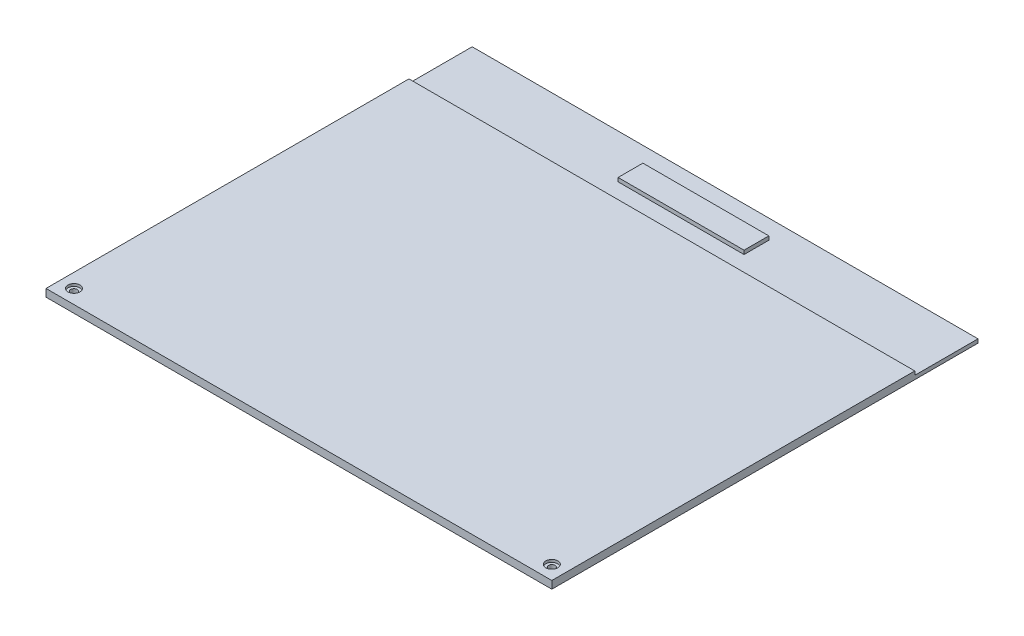
ISO-10303-21;
HEADER;
FILE_DESCRIPTION(('STEP AP214'),'2;1');
FILE_NAME('part.step','',(''),(''),'','','');
FILE_SCHEMA(('AUTOMOTIVE_DESIGN { 1 0 10303 214 1 1 1 1 }'));
ENDSEC;
DATA;
#1=APPLICATION_CONTEXT('core data for automotive mechanical design processes');
#2=APPLICATION_PROTOCOL_DEFINITION('international standard','automotive_design',2000,#1);
#3=PRODUCT_CONTEXT('',#1,'mechanical');
#4=PRODUCT('Part','Part','',(#3));
#5=PRODUCT_RELATED_PRODUCT_CATEGORY('part','',(#4));
#6=PRODUCT_DEFINITION_FORMATION('','',#4);
#7=PRODUCT_DEFINITION_CONTEXT('part definition',#1,'design');
#8=PRODUCT_DEFINITION('design','',#6,#7);
#9=PRODUCT_DEFINITION_SHAPE('','',#8);
#10=(LENGTH_UNIT() NAMED_UNIT(*) SI_UNIT(.MILLI.,.METRE.));
#11=(NAMED_UNIT(*) PLANE_ANGLE_UNIT() SI_UNIT($,.RADIAN.));
#12=(NAMED_UNIT(*) SI_UNIT($,.STERADIAN.) SOLID_ANGLE_UNIT());
#13=UNCERTAINTY_MEASURE_WITH_UNIT(LENGTH_MEASURE(1.E-05),#10,'distance_accuracy_value','');
#14=(GEOMETRIC_REPRESENTATION_CONTEXT(3) GLOBAL_UNCERTAINTY_ASSIGNED_CONTEXT((#13)) GLOBAL_UNIT_ASSIGNED_CONTEXT((#10,
#11,#12)) REPRESENTATION_CONTEXT('',''));
#15=CARTESIAN_POINT('',(0.,0.,0.));
#16=DIRECTION('',(0.,0.,1.));
#17=DIRECTION('',(1.,0.,0.));
#18=AXIS2_PLACEMENT_3D('',#15,#16,#17);
#19=CARTESIAN_POINT('',(100.,1.5,-33.5));
#20=DIRECTION('',(0.,-1.,0.));
#21=DIRECTION('',(0.,0.,-1.));
#22=AXIS2_PLACEMENT_3D('',#19,#20,#21);
#23=PLANE('',#22);
#24=DIRECTION('',(1.,0.,0.));
#25=VECTOR('',#24,1.);
#26=CARTESIAN_POINT('',(100.,1.5,-8.5));
#27=LINE('',#26,#25);
#28=CARTESIAN_POINT('',(-100.,1.5,-8.50000000000001));
#29=VERTEX_POINT('',#28);
#30=CARTESIAN_POINT('',(100.,1.5,-8.5));
#31=VERTEX_POINT('',#30);
#32=EDGE_CURVE('E132',#29,#31,#27,.T.);
#33=ORIENTED_EDGE('',*,*,#32,.T.);
#34=DIRECTION('',(0.,0.,1.));
#35=VECTOR('',#34,1.);
#36=CARTESIAN_POINT('',(100.,1.5,-33.5));
#37=LINE('',#36,#35);
#38=CARTESIAN_POINT('',(100.,1.5,-33.5));
#39=VERTEX_POINT('',#38);
#40=EDGE_CURVE('E149',#39,#31,#37,.T.);
#41=ORIENTED_EDGE('',*,*,#40,.F.);
#42=DIRECTION('',(1.,0.,0.));
#43=VECTOR('',#42,1.);
#44=CARTESIAN_POINT('',(100.,1.5,-33.5));
#45=LINE('',#44,#43);
#46=CARTESIAN_POINT('',(-100.,1.5,-33.5));
#47=VERTEX_POINT('',#46);
#48=EDGE_CURVE('E148',#47,#39,#45,.T.);
#49=ORIENTED_EDGE('',*,*,#48,.F.);
#50=DIRECTION('',(0.,0.,1.));
#51=VECTOR('',#50,1.);
#52=CARTESIAN_POINT('',(-100.,1.5,-33.5));
#53=LINE('',#52,#51);
#54=EDGE_CURVE('E153',#47,#29,#53,.T.);
#55=ORIENTED_EDGE('',*,*,#54,.T.);
#56=EDGE_LOOP('',(#33,#41,#49,#55));
#57=FACE_BOUND('',#56,.T.);
#58=DIRECTION('',(0.,0.,1.));
#59=VECTOR('',#58,1.);
#60=CARTESIAN_POINT('',(-24.9,1.5,-25.9));
#61=LINE('',#60,#59);
#62=CARTESIAN_POINT('',(-24.9,1.5,-25.9));
#63=VERTEX_POINT('',#62);
#64=CARTESIAN_POINT('',(-24.9,1.5,-16.1));
#65=VERTEX_POINT('',#64);
#66=EDGE_CURVE('E131',#63,#65,#61,.T.);
#67=ORIENTED_EDGE('',*,*,#66,.F.);
#68=DIRECTION('',(-1.,0.,0.));
#69=VECTOR('',#68,1.);
#70=CARTESIAN_POINT('',(24.9,1.5,-25.9));
#71=LINE('',#70,#69);
#72=CARTESIAN_POINT('',(24.9,1.5,-25.9));
#73=VERTEX_POINT('',#72);
#74=EDGE_CURVE('E128',#73,#63,#71,.T.);
#75=ORIENTED_EDGE('',*,*,#74,.F.);
#76=DIRECTION('',(0.,0.,-1.));
#77=VECTOR('',#76,1.);
#78=CARTESIAN_POINT('',(24.9,1.5,-25.9));
#79=LINE('',#78,#77);
#80=CARTESIAN_POINT('',(24.9,1.5,-16.1));
#81=VERTEX_POINT('',#80);
#82=EDGE_CURVE('E54',#81,#73,#79,.T.);
#83=ORIENTED_EDGE('',*,*,#82,.F.);
#84=DIRECTION('',(1.,0.,0.));
#85=VECTOR('',#84,1.);
#86=CARTESIAN_POINT('',(24.9,1.5,-16.1));
#87=LINE('',#86,#85);
#88=EDGE_CURVE('E49',#65,#81,#87,.T.);
#89=ORIENTED_EDGE('',*,*,#88,.F.);
#90=EDGE_LOOP('',(#67,#75,#83,#89));
#91=FACE_BOUND('',#90,.T.);
#92=ADVANCED_FACE('F33',(#57,#91),#23,.F.);
#93=CARTESIAN_POINT('',(0.,0.,-8.5));
#94=DIRECTION('',(0.,0.,1.));
#95=DIRECTION('',(1.,0.,0.));
#96=AXIS2_PLACEMENT_3D('',#93,#94,#95);
#97=PLANE('',#96);
#98=ORIENTED_EDGE('',*,*,#32,.F.);
#99=DIRECTION('',(0.,-1.,0.));
#100=VECTOR('',#99,1.);
#101=CARTESIAN_POINT('',(-100.,3.,-8.50000000000001));
#102=LINE('',#101,#100);
#103=CARTESIAN_POINT('',(-100.,3.,-8.50000000000001));
#104=VERTEX_POINT('',#103);
#105=EDGE_CURVE('E11',#104,#29,#102,.T.);
#106=ORIENTED_EDGE('',*,*,#105,.F.);
#107=DIRECTION('',(-1.,0.,0.));
#108=VECTOR('',#107,1.);
#109=CARTESIAN_POINT('',(0.,3.,-8.5));
#110=LINE('',#109,#108);
#111=CARTESIAN_POINT('',(100.,3.,-8.50000000000001));
#112=VERTEX_POINT('',#111);
#113=EDGE_CURVE('E37',#112,#104,#110,.T.);
#114=ORIENTED_EDGE('',*,*,#113,.F.);
#115=DIRECTION('',(0.,1.,0.));
#116=VECTOR('',#115,1.);
#117=CARTESIAN_POINT('',(100.,3.,-8.50000000000001));
#118=LINE('',#117,#116);
#119=EDGE_CURVE('E42',#31,#112,#118,.T.);
#120=ORIENTED_EDGE('',*,*,#119,.F.);
#121=EDGE_LOOP('',(#98,#106,#114,#120));
#122=FACE_BOUND('',#121,.T.);
#123=ADVANCED_FACE('F35',(#122),#97,.F.);
#124=CARTESIAN_POINT('',(94.474873734153,0.,129.474873734153));
#125=DIRECTION('',(0.,1.,0.));
#126=DIRECTION('',(0.,0.,1.));
#127=AXIS2_PLACEMENT_3D('',#124,#125,#126);
#128=CYLINDRICAL_SURFACE('',#127,1.29999999999999);
#129=CARTESIAN_POINT('',(94.474873734153,0.,129.474873734153));
#130=DIRECTION('',(0.,1.,0.));
#131=DIRECTION('',(0.,0.,1.));
#132=AXIS2_PLACEMENT_3D('',#129,#130,#131);
#133=CIRCLE('',#132,1.29999999999999);
#134=CARTESIAN_POINT('',(94.474873734153,0.,130.774873734153));
#135=VERTEX_POINT('',#134);
#136=EDGE_CURVE('E169',#135,#135,#133,.T.);
#137=ORIENTED_EDGE('',*,*,#136,.F.);
#138=EDGE_LOOP('',(#137));
#139=FACE_BOUND('',#138,.T.);
#140=CARTESIAN_POINT('',(94.474873734153,2.,129.474873734153));
#141=DIRECTION('',(0.,1.,0.));
#142=DIRECTION('',(0.,0.,1.));
#143=AXIS2_PLACEMENT_3D('',#140,#141,#142);
#144=CIRCLE('',#143,1.29999999999999);
#145=CARTESIAN_POINT('',(94.474873734153,2.,130.774873734153));
#146=VERTEX_POINT('',#145);
#147=EDGE_CURVE('E176',#146,#146,#144,.F.);
#148=ORIENTED_EDGE('',*,*,#147,.F.);
#149=EDGE_LOOP('',(#148));
#150=FACE_BOUND('',#149,.T.);
#151=ADVANCED_FACE('F238',(#139,#150),#128,.F.);
#152=CARTESIAN_POINT('',(-94.4748737341529,0.,129.474873734153));
#153=DIRECTION('',(0.,1.,0.));
#154=DIRECTION('',(0.,0.,1.));
#155=AXIS2_PLACEMENT_3D('',#152,#153,#154);
#156=CYLINDRICAL_SURFACE('',#155,1.29999999999999);
#157=CARTESIAN_POINT('',(-94.4748737341529,0.,129.474873734153));
#158=DIRECTION('',(0.,1.,0.));
#159=DIRECTION('',(0.,0.,-1.));
#160=AXIS2_PLACEMENT_3D('',#157,#158,#159);
#161=CIRCLE('',#160,1.29999999999999);
#162=CARTESIAN_POINT('',(-94.4748737341529,0.,128.174873734153));
#163=VERTEX_POINT('',#162);
#164=EDGE_CURVE('E173',#163,#163,#161,.T.);
#165=ORIENTED_EDGE('',*,*,#164,.F.);
#166=EDGE_LOOP('',(#165));
#167=FACE_BOUND('',#166,.T.);
#168=CARTESIAN_POINT('',(-94.4748737341529,2.,129.474873734153));
#169=DIRECTION('',(0.,1.,0.));
#170=DIRECTION('',(0.,0.,1.));
#171=AXIS2_PLACEMENT_3D('',#168,#169,#170);
#172=CIRCLE('',#171,1.29999999999999);
#173=CARTESIAN_POINT('',(-94.4748737341529,2.,130.774873734153));
#174=VERTEX_POINT('',#173);
#175=EDGE_CURVE('E166',#174,#174,#172,.F.);
#176=ORIENTED_EDGE('',*,*,#175,.F.);
#177=EDGE_LOOP('',(#176));
#178=FACE_BOUND('',#177,.T.);
#179=ADVANCED_FACE('F261',(#167,#178),#156,.F.);
#180=CARTESIAN_POINT('',(-100.,3.,-135.));
#181=DIRECTION('',(1.,0.,0.));
#182=DIRECTION('',(0.,0.,-1.));
#183=AXIS2_PLACEMENT_3D('',#180,#181,#182);
#184=PLANE('',#183);
#185=DIRECTION('',(0.,0.,1.));
#186=VECTOR('',#185,1.);
#187=CARTESIAN_POINT('',(-100.,3.,-135.));
#188=LINE('',#187,#186);
#189=CARTESIAN_POINT('',(-100.,3.,135.));
#190=VERTEX_POINT('',#189);
#191=EDGE_CURVE('E177',#104,#190,#188,.T.);
#192=ORIENTED_EDGE('',*,*,#191,.F.);
#193=ORIENTED_EDGE('',*,*,#105,.T.);
#194=ORIENTED_EDGE('',*,*,#54,.F.);
#195=DIRECTION('',(0.,1.,0.));
#196=VECTOR('',#195,1.);
#197=CARTESIAN_POINT('',(-100.,0.,-33.5));
#198=LINE('',#197,#196);
#199=CARTESIAN_POINT('',(-100.,0.,-33.5));
#200=VERTEX_POINT('',#199);
#201=EDGE_CURVE('E146',#200,#47,#198,.T.);
#202=ORIENTED_EDGE('',*,*,#201,.F.);
#203=DIRECTION('',(0.,0.,1.));
#204=VECTOR('',#203,1.);
#205=CARTESIAN_POINT('',(-100.,0.,-135.));
#206=LINE('',#205,#204);
#207=CARTESIAN_POINT('',(-100.,0.,135.));
#208=VERTEX_POINT('',#207);
#209=EDGE_CURVE('E172',#200,#208,#206,.T.);
#210=ORIENTED_EDGE('',*,*,#209,.T.);
#211=DIRECTION('',(0.,-1.,0.));
#212=VECTOR('',#211,1.);
#213=CARTESIAN_POINT('',(-100.,3.,135.));
#214=LINE('',#213,#212);
#215=EDGE_CURVE('E192',#190,#208,#214,.T.);
#216=ORIENTED_EDGE('',*,*,#215,.F.);
#217=EDGE_LOOP('',(#192,#193,#194,#202,#210,#216));
#218=FACE_BOUND('',#217,.T.);
#219=ADVANCED_FACE('F211',(#218),#184,.F.);
#220=CARTESIAN_POINT('',(100.,3.,135.));
#221=DIRECTION('',(0.,0.,-1.));
#222=DIRECTION('',(-1.,0.,0.));
#223=AXIS2_PLACEMENT_3D('',#220,#221,#222);
#224=PLANE('',#223);
#225=DIRECTION('',(1.,0.,0.));
#226=VECTOR('',#225,1.);
#227=CARTESIAN_POINT('',(100.,0.,135.));
#228=LINE('',#227,#226);
#229=CARTESIAN_POINT('',(100.,0.,135.));
#230=VERTEX_POINT('',#229);
#231=EDGE_CURVE('E187',#208,#230,#228,.T.);
#232=ORIENTED_EDGE('',*,*,#231,.T.);
#233=DIRECTION('',(0.,-1.,0.));
#234=VECTOR('',#233,1.);
#235=CARTESIAN_POINT('',(100.,3.,135.));
#236=LINE('',#235,#234);
#237=CARTESIAN_POINT('',(100.,3.,135.));
#238=VERTEX_POINT('',#237);
#239=EDGE_CURVE('E185',#238,#230,#236,.T.);
#240=ORIENTED_EDGE('',*,*,#239,.F.);
#241=DIRECTION('',(1.,0.,0.));
#242=VECTOR('',#241,1.);
#243=CARTESIAN_POINT('',(100.,3.,135.));
#244=LINE('',#243,#242);
#245=EDGE_CURVE('E179',#190,#238,#244,.T.);
#246=ORIENTED_EDGE('',*,*,#245,.F.);
#247=ORIENTED_EDGE('',*,*,#215,.T.);
#248=EDGE_LOOP('',(#232,#240,#246,#247));
#249=FACE_BOUND('',#248,.T.);
#250=ADVANCED_FACE('F215',(#249),#224,.F.);
#251=CARTESIAN_POINT('',(100.,3.,-135.));
#252=DIRECTION('',(-1.,0.,0.));
#253=DIRECTION('',(0.,0.,1.));
#254=AXIS2_PLACEMENT_3D('',#251,#252,#253);
#255=PLANE('',#254);
#256=DIRECTION('',(0.,0.,-1.));
#257=VECTOR('',#256,1.);
#258=CARTESIAN_POINT('',(100.,0.,-135.));
#259=LINE('',#258,#257);
#260=CARTESIAN_POINT('',(100.,0.,-33.5));
#261=VERTEX_POINT('',#260);
#262=EDGE_CURVE('E180',#230,#261,#259,.T.);
#263=ORIENTED_EDGE('',*,*,#262,.T.);
#264=DIRECTION('',(0.,-1.,0.));
#265=VECTOR('',#264,1.);
#266=CARTESIAN_POINT('',(100.,0.,-33.5));
#267=LINE('',#266,#265);
#268=EDGE_CURVE('E135',#39,#261,#267,.T.);
#269=ORIENTED_EDGE('',*,*,#268,.F.);
#270=ORIENTED_EDGE('',*,*,#40,.T.);
#271=ORIENTED_EDGE('',*,*,#119,.T.);
#272=DIRECTION('',(0.,0.,-1.));
#273=VECTOR('',#272,1.);
#274=CARTESIAN_POINT('',(100.,3.,-135.));
#275=LINE('',#274,#273);
#276=EDGE_CURVE('E182',#238,#112,#275,.T.);
#277=ORIENTED_EDGE('',*,*,#276,.F.);
#278=ORIENTED_EDGE('',*,*,#239,.T.);
#279=EDGE_LOOP('',(#263,#269,#270,#271,#277,#278));
#280=FACE_BOUND('',#279,.T.);
#281=ADVANCED_FACE('F218',(#280),#255,.F.);
#282=CARTESIAN_POINT('',(0.,3.,0.));
#283=DIRECTION('',(0.,-1.,0.));
#284=DIRECTION('',(0.,0.,-1.));
#285=AXIS2_PLACEMENT_3D('',#282,#283,#284);
#286=PLANE('',#285);
#287=CARTESIAN_POINT('',(-94.4748737341529,3.,129.474873734153));
#288=DIRECTION('',(0.,1.,0.));
#289=DIRECTION('',(0.,0.,1.));
#290=AXIS2_PLACEMENT_3D('',#287,#288,#289);
#291=CIRCLE('',#290,2.375);
#292=CARTESIAN_POINT('',(-94.4748737341529,3.,131.849873734153));
#293=VERTEX_POINT('',#292);
#294=EDGE_CURVE('E160',#293,#293,#291,.T.);
#295=ORIENTED_EDGE('',*,*,#294,.F.);
#296=EDGE_LOOP('',(#295));
#297=FACE_BOUND('',#296,.T.);
#298=CARTESIAN_POINT('',(94.474873734153,3.,129.474873734153));
#299=DIRECTION('',(0.,1.,0.));
#300=DIRECTION('',(0.,0.,1.));
#301=AXIS2_PLACEMENT_3D('',#298,#299,#300);
#302=CIRCLE('',#301,2.375);
#303=CARTESIAN_POINT('',(94.474873734153,3.,131.849873734153));
#304=VERTEX_POINT('',#303);
#305=EDGE_CURVE('E156',#304,#304,#302,.T.);
#306=ORIENTED_EDGE('',*,*,#305,.F.);
#307=EDGE_LOOP('',(#306));
#308=FACE_BOUND('',#307,.T.);
#309=ORIENTED_EDGE('',*,*,#276,.T.);
#310=ORIENTED_EDGE('',*,*,#113,.T.);
#311=ORIENTED_EDGE('',*,*,#191,.T.);
#312=ORIENTED_EDGE('',*,*,#245,.T.);
#313=EDGE_LOOP('',(#309,#310,#311,#312));
#314=FACE_BOUND('',#313,.T.);
#315=ADVANCED_FACE('F204',(#297,#308,#314),#286,.F.);
#316=CARTESIAN_POINT('',(0.,0.,0.));
#317=DIRECTION('',(0.,-1.,0.));
#318=DIRECTION('',(0.,0.,-1.));
#319=AXIS2_PLACEMENT_3D('',#316,#317,#318);
#320=PLANE('',#319);
#321=ORIENTED_EDGE('',*,*,#209,.F.);
#322=DIRECTION('',(-1.,0.,0.));
#323=VECTOR('',#322,1.);
#324=CARTESIAN_POINT('',(100.,0.,-33.5));
#325=LINE('',#324,#323);
#326=EDGE_CURVE('E143',#261,#200,#325,.T.);
#327=ORIENTED_EDGE('',*,*,#326,.F.);
#328=ORIENTED_EDGE('',*,*,#262,.F.);
#329=ORIENTED_EDGE('',*,*,#231,.F.);
#330=EDGE_LOOP('',(#321,#327,#328,#329));
#331=FACE_BOUND('',#330,.T.);
#332=ORIENTED_EDGE('',*,*,#164,.T.);
#333=EDGE_LOOP('',(#332));
#334=FACE_BOUND('',#333,.T.);
#335=ORIENTED_EDGE('',*,*,#136,.T.);
#336=EDGE_LOOP('',(#335));
#337=FACE_BOUND('',#336,.T.);
#338=ADVANCED_FACE('F227',(#331,#334,#337),#320,.T.);
#339=CARTESIAN_POINT('',(-94.4748737341529,2.,129.474873734153));
#340=DIRECTION('',(0.,1.,0.));
#341=DIRECTION('',(0.,0.,1.));
#342=AXIS2_PLACEMENT_3D('',#339,#340,#341);
#343=PLANE('',#342);
#344=CARTESIAN_POINT('',(-94.4748737341529,2.,129.474873734153));
#345=DIRECTION('',(0.,1.,0.));
#346=DIRECTION('',(0.,0.,1.));
#347=AXIS2_PLACEMENT_3D('',#344,#345,#346);
#348=CIRCLE('',#347,2.375);
#349=CARTESIAN_POINT('',(-94.4748737341529,2.,131.849873734153));
#350=VERTEX_POINT('',#349);
#351=EDGE_CURVE('E163',#350,#350,#348,.T.);
#352=ORIENTED_EDGE('',*,*,#351,.T.);
#353=EDGE_LOOP('',(#352));
#354=FACE_BOUND('',#353,.T.);
#355=ORIENTED_EDGE('',*,*,#175,.T.);
#356=EDGE_LOOP('',(#355));
#357=FACE_BOUND('',#356,.T.);
#358=ADVANCED_FACE('F252',(#354,#357),#343,.T.);
#359=CARTESIAN_POINT('',(-94.4748737341529,2.,129.474873734153));
#360=DIRECTION('',(0.,1.,0.));
#361=DIRECTION('',(0.,0.,1.));
#362=AXIS2_PLACEMENT_3D('',#359,#360,#361);
#363=CYLINDRICAL_SURFACE('',#362,2.375);
#364=ORIENTED_EDGE('',*,*,#351,.F.);
#365=EDGE_LOOP('',(#364));
#366=FACE_BOUND('',#365,.T.);
#367=ORIENTED_EDGE('',*,*,#294,.T.);
#368=EDGE_LOOP('',(#367));
#369=FACE_BOUND('',#368,.T.);
#370=ADVANCED_FACE('F247',(#366,#369),#363,.F.);
#371=CARTESIAN_POINT('',(94.474873734153,2.,129.474873734153));
#372=DIRECTION('',(0.,1.,0.));
#373=DIRECTION('',(0.,0.,1.));
#374=AXIS2_PLACEMENT_3D('',#371,#372,#373);
#375=PLANE('',#374);
#376=CARTESIAN_POINT('',(94.474873734153,2.,129.474873734153));
#377=DIRECTION('',(0.,1.,0.));
#378=DIRECTION('',(0.,0.,1.));
#379=AXIS2_PLACEMENT_3D('',#376,#377,#378);
#380=CIRCLE('',#379,2.375);
#381=CARTESIAN_POINT('',(94.474873734153,2.,131.849873734153));
#382=VERTEX_POINT('',#381);
#383=EDGE_CURVE('E157',#382,#382,#380,.T.);
#384=ORIENTED_EDGE('',*,*,#383,.T.);
#385=EDGE_LOOP('',(#384));
#386=FACE_BOUND('',#385,.T.);
#387=ORIENTED_EDGE('',*,*,#147,.T.);
#388=EDGE_LOOP('',(#387));
#389=FACE_BOUND('',#388,.T.);
#390=ADVANCED_FACE('F244',(#386,#389),#375,.T.);
#391=CARTESIAN_POINT('',(94.474873734153,2.,129.474873734153));
#392=DIRECTION('',(0.,1.,0.));
#393=DIRECTION('',(0.,0.,1.));
#394=AXIS2_PLACEMENT_3D('',#391,#392,#393);
#395=CYLINDRICAL_SURFACE('',#394,2.375);
#396=ORIENTED_EDGE('',*,*,#383,.F.);
#397=EDGE_LOOP('',(#396));
#398=FACE_BOUND('',#397,.T.);
#399=ORIENTED_EDGE('',*,*,#305,.T.);
#400=EDGE_LOOP('',(#399));
#401=FACE_BOUND('',#400,.T.);
#402=ADVANCED_FACE('F239',(#398,#401),#395,.F.);
#403=CARTESIAN_POINT('',(0.,0.,-33.5));
#404=DIRECTION('',(0.,0.,1.));
#405=DIRECTION('',(1.,0.,0.));
#406=AXIS2_PLACEMENT_3D('',#403,#404,#405);
#407=PLANE('',#406);
#408=ORIENTED_EDGE('',*,*,#268,.T.);
#409=ORIENTED_EDGE('',*,*,#326,.T.);
#410=ORIENTED_EDGE('',*,*,#201,.T.);
#411=ORIENTED_EDGE('',*,*,#48,.T.);
#412=EDGE_LOOP('',(#408,#409,#410,#411));
#413=FACE_BOUND('',#412,.T.);
#414=ADVANCED_FACE('F242',(#413),#407,.F.);
#415=CARTESIAN_POINT('',(-24.9,3.,-25.9));
#416=DIRECTION('',(1.,0.,0.));
#417=DIRECTION('',(0.,0.,-1.));
#418=AXIS2_PLACEMENT_3D('',#415,#416,#417);
#419=PLANE('',#418);
#420=ORIENTED_EDGE('',*,*,#66,.T.);
#421=DIRECTION('',(0.,-1.,0.));
#422=VECTOR('',#421,1.);
#423=CARTESIAN_POINT('',(-24.9,3.,-16.1));
#424=LINE('',#423,#422);
#425=CARTESIAN_POINT('',(-24.9,3.,-16.1));
#426=VERTEX_POINT('',#425);
#427=EDGE_CURVE('E112',#426,#65,#424,.T.);
#428=ORIENTED_EDGE('',*,*,#427,.F.);
#429=DIRECTION('',(0.,0.,1.));
#430=VECTOR('',#429,1.);
#431=CARTESIAN_POINT('',(-24.9,3.,-25.9));
#432=LINE('',#431,#430);
#433=CARTESIAN_POINT('',(-24.9,3.,-25.9));
#434=VERTEX_POINT('',#433);
#435=EDGE_CURVE('E119',#434,#426,#432,.T.);
#436=ORIENTED_EDGE('',*,*,#435,.F.);
#437=DIRECTION('',(0.,-1.,0.));
#438=VECTOR('',#437,1.);
#439=CARTESIAN_POINT('',(-24.9,3.,-25.9));
#440=LINE('',#439,#438);
#441=EDGE_CURVE('E416',#434,#63,#440,.T.);
#442=ORIENTED_EDGE('',*,*,#441,.T.);
#443=EDGE_LOOP('',(#420,#428,#436,#442));
#444=FACE_BOUND('',#443,.T.);
#445=ADVANCED_FACE('F130',(#444),#419,.F.);
#446=CARTESIAN_POINT('',(24.9,3.,-16.1));
#447=DIRECTION('',(0.,0.,-1.));
#448=DIRECTION('',(-1.,0.,0.));
#449=AXIS2_PLACEMENT_3D('',#446,#447,#448);
#450=PLANE('',#449);
#451=ORIENTED_EDGE('',*,*,#88,.T.);
#452=DIRECTION('',(0.,-1.,0.));
#453=VECTOR('',#452,1.);
#454=CARTESIAN_POINT('',(24.9,3.,-16.1));
#455=LINE('',#454,#453);
#456=CARTESIAN_POINT('',(24.9,3.,-16.1));
#457=VERTEX_POINT('',#456);
#458=EDGE_CURVE('E115',#457,#81,#455,.T.);
#459=ORIENTED_EDGE('',*,*,#458,.F.);
#460=DIRECTION('',(1.,0.,0.));
#461=VECTOR('',#460,1.);
#462=CARTESIAN_POINT('',(24.9,3.,-16.1));
#463=LINE('',#462,#461);
#464=EDGE_CURVE('E108',#426,#457,#463,.T.);
#465=ORIENTED_EDGE('',*,*,#464,.F.);
#466=ORIENTED_EDGE('',*,*,#427,.T.);
#467=EDGE_LOOP('',(#451,#459,#465,#466));
#468=FACE_BOUND('',#467,.T.);
#469=ADVANCED_FACE('F110',(#468),#450,.F.);
#470=CARTESIAN_POINT('',(24.9,3.,-25.9));
#471=DIRECTION('',(-1.,0.,0.));
#472=DIRECTION('',(0.,0.,1.));
#473=AXIS2_PLACEMENT_3D('',#470,#471,#472);
#474=PLANE('',#473);
#475=ORIENTED_EDGE('',*,*,#82,.T.);
#476=DIRECTION('',(0.,-1.,0.));
#477=VECTOR('',#476,1.);
#478=CARTESIAN_POINT('',(24.9,3.,-25.9));
#479=LINE('',#478,#477);
#480=CARTESIAN_POINT('',(24.9,3.,-25.9));
#481=VERTEX_POINT('',#480);
#482=EDGE_CURVE('E137',#481,#73,#479,.T.);
#483=ORIENTED_EDGE('',*,*,#482,.F.);
#484=DIRECTION('',(0.,0.,-1.));
#485=VECTOR('',#484,1.);
#486=CARTESIAN_POINT('',(24.9,3.,-25.9));
#487=LINE('',#486,#485);
#488=EDGE_CURVE('E118',#457,#481,#487,.T.);
#489=ORIENTED_EDGE('',*,*,#488,.F.);
#490=ORIENTED_EDGE('',*,*,#458,.T.);
#491=EDGE_LOOP('',(#475,#483,#489,#490));
#492=FACE_BOUND('',#491,.T.);
#493=ADVANCED_FACE('F289',(#492),#474,.F.);
#494=CARTESIAN_POINT('',(24.9,3.,-25.9));
#495=DIRECTION('',(0.,0.,1.));
#496=DIRECTION('',(1.,0.,0.));
#497=AXIS2_PLACEMENT_3D('',#494,#495,#496);
#498=PLANE('',#497);
#499=ORIENTED_EDGE('',*,*,#74,.T.);
#500=ORIENTED_EDGE('',*,*,#441,.F.);
#501=DIRECTION('',(-1.,0.,0.));
#502=VECTOR('',#501,1.);
#503=CARTESIAN_POINT('',(24.9,3.,-25.9));
#504=LINE('',#503,#502);
#505=EDGE_CURVE('E124',#481,#434,#504,.T.);
#506=ORIENTED_EDGE('',*,*,#505,.F.);
#507=ORIENTED_EDGE('',*,*,#482,.T.);
#508=EDGE_LOOP('',(#499,#500,#506,#507));
#509=FACE_BOUND('',#508,.T.);
#510=ADVANCED_FACE('F294',(#509),#498,.F.);
#511=CARTESIAN_POINT('',(0.,3.,0.));
#512=DIRECTION('',(0.,-1.,0.));
#513=DIRECTION('',(0.,0.,-1.));
#514=AXIS2_PLACEMENT_3D('',#511,#512,#513);
#515=PLANE('',#514);
#516=ORIENTED_EDGE('',*,*,#435,.T.);
#517=ORIENTED_EDGE('',*,*,#464,.T.);
#518=ORIENTED_EDGE('',*,*,#488,.T.);
#519=ORIENTED_EDGE('',*,*,#505,.T.);
#520=EDGE_LOOP('',(#516,#517,#518,#519));
#521=FACE_BOUND('',#520,.T.);
#522=ADVANCED_FACE('F122',(#521),#515,.F.);
#523=CLOSED_SHELL('',(#92,#123,#151,#179,#219,#250,#281,#315,#338,#358,#370,#390,#402,#414,#445,
#469,#493,#510,#522));
#524=MANIFOLD_SOLID_BREP('B2',#523);
#525=ADVANCED_BREP_SHAPE_REPRESENTATION('',(#18,#524),#14);
#526=SHAPE_DEFINITION_REPRESENTATION(#9,#525);
ENDSEC;
END-ISO-10303-21;
